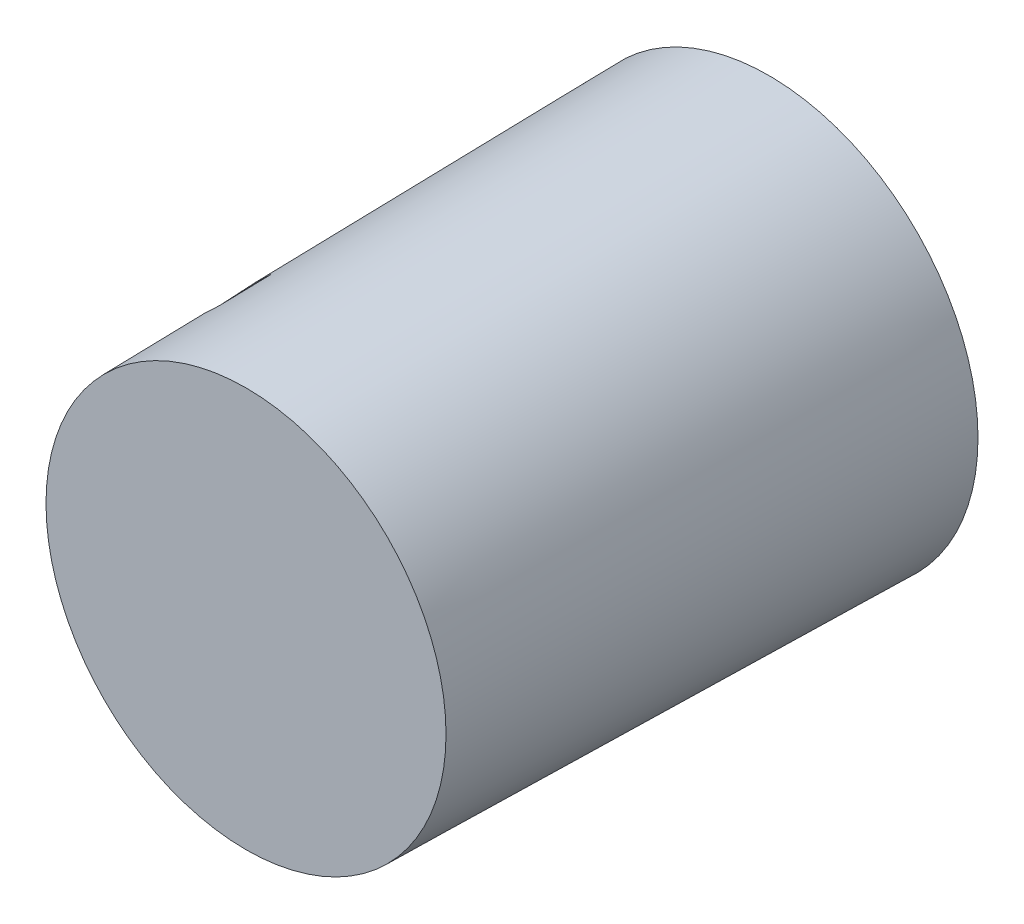
ISO-10303-21;
HEADER;
FILE_DESCRIPTION(('STEP AP214'),'2;1');
FILE_NAME('part.step','',(''),(''),'','','');
FILE_SCHEMA(('AUTOMOTIVE_DESIGN { 1 0 10303 214 1 1 1 1 }'));
ENDSEC;
DATA;
#1=APPLICATION_CONTEXT('core data for automotive mechanical design processes');
#2=APPLICATION_PROTOCOL_DEFINITION('international standard','automotive_design',2000,#1);
#3=PRODUCT_CONTEXT('',#1,'mechanical');
#4=PRODUCT('Part','Part','',(#3));
#5=PRODUCT_RELATED_PRODUCT_CATEGORY('part','',(#4));
#6=PRODUCT_DEFINITION_FORMATION('','',#4);
#7=PRODUCT_DEFINITION_CONTEXT('part definition',#1,'design');
#8=PRODUCT_DEFINITION('design','',#6,#7);
#9=PRODUCT_DEFINITION_SHAPE('','',#8);
#10=(LENGTH_UNIT() NAMED_UNIT(*) SI_UNIT(.MILLI.,.METRE.));
#11=(NAMED_UNIT(*) PLANE_ANGLE_UNIT() SI_UNIT($,.RADIAN.));
#12=(NAMED_UNIT(*) SI_UNIT($,.STERADIAN.) SOLID_ANGLE_UNIT());
#13=UNCERTAINTY_MEASURE_WITH_UNIT(LENGTH_MEASURE(1.E-05),#10,'distance_accuracy_value','');
#14=(GEOMETRIC_REPRESENTATION_CONTEXT(3) GLOBAL_UNCERTAINTY_ASSIGNED_CONTEXT((#13)) GLOBAL_UNIT_ASSIGNED_CONTEXT((#10,
#11,#12)) REPRESENTATION_CONTEXT('',''));
#15=CARTESIAN_POINT('',(0.,0.,0.));
#16=DIRECTION('',(0.,0.,1.));
#17=DIRECTION('',(1.,0.,0.));
#18=AXIS2_PLACEMENT_3D('',#15,#16,#17);
#19=CARTESIAN_POINT('',(0.,0.,0.));
#20=DIRECTION('',(0.,0.,-1.));
#21=DIRECTION('',(1.,0.,0.));
#22=AXIS2_PLACEMENT_3D('',#19,#20,#21);
#23=CONICAL_SURFACE('',#22,10.,0.0174532925199433);
#24=CARTESIAN_POINT('',(0.,0.,0.));
#25=DIRECTION('',(0.,0.,1.));
#26=DIRECTION('',(1.,0.,0.));
#27=AXIS2_PLACEMENT_3D('',#24,#25,#26);
#28=CIRCLE('',#27,10.);
#29=CARTESIAN_POINT('',(10.,0.,0.));
#30=VERTEX_POINT('',#29);
#31=EDGE_CURVE('E154',#30,#30,#28,.T.);
#32=ORIENTED_EDGE('',*,*,#31,.T.);
#33=EDGE_LOOP('',(#32));
#34=FACE_BOUND('',#33,.T.);
#35=CARTESIAN_POINT('',(0.,0.,25.));
#36=DIRECTION('',(0.,0.,1.));
#37=DIRECTION('',(1.,0.,0.));
#38=AXIS2_PLACEMENT_3D('',#35,#36,#37);
#39=CIRCLE('',#38,9.56362337679456);
#40=CARTESIAN_POINT('',(9.56362337679456,0.,25.));
#41=VERTEX_POINT('',#40);
#42=EDGE_CURVE('E56',#41,#41,#39,.T.);
#43=ORIENTED_EDGE('',*,*,#42,.F.);
#44=EDGE_LOOP('',(#43));
#45=FACE_BOUND('',#44,.T.);
#46=CARTESIAN_POINT('',(-8.35035481952416,4.82107960288119,20.5006853717962));
#47=CARTESIAN_POINT('',(-8.30901590989764,4.89267739384217,20.5006807792256));
#48=CARTESIAN_POINT('',(-8.26681754377874,4.96386055335001,20.4938263438443));
#49=CARTESIAN_POINT('',(-8.18206861712117,5.1032462062416,20.4666106198321));
#50=CARTESIAN_POINT('',(-8.13951838046467,5.17145114141038,20.4462606262934));
#51=CARTESIAN_POINT('',(-8.05539336276017,5.30323951851139,20.3926573244357));
#52=CARTESIAN_POINT('',(-8.01381855207625,5.36682310097552,20.3594044086802));
#53=CARTESIAN_POINT('',(-7.93310456226344,5.48783853942176,20.2809245792719));
#54=CARTESIAN_POINT('',(-7.89396531158249,5.54527057616021,20.2356980175871));
#55=CARTESIAN_POINT('',(-7.81957668164205,5.65270130917386,20.1344978254785));
#56=CARTESIAN_POINT('',(-7.78432724575179,5.70270011367122,20.0785243515487));
#57=CARTESIAN_POINT('',(-7.71910988342622,5.79419815282617,19.9573168354241));
#58=CARTESIAN_POINT('',(-7.68914199900527,5.83569731987021,19.892082719569));
#59=CARTESIAN_POINT('',(-7.63574415619,5.90933185218868,19.7540811313584));
#60=CARTESIAN_POINT('',(-7.61231438493825,5.94146694943341,19.6813134434487));
#61=CARTESIAN_POINT('',(-7.57306601782308,5.9956608908538,19.5303154595712));
#62=CARTESIAN_POINT('',(-7.55723595520645,6.01773491303073,19.4520935986338));
#63=CARTESIAN_POINT('',(-7.53391967664121,6.05134884464351,19.2925450553513));
#64=CARTESIAN_POINT('',(-7.52640078671282,6.06292997249158,19.2112318406473));
#65=CARTESIAN_POINT('',(-7.51996163233247,6.07546350569193,19.0475061914602));
#66=CARTESIAN_POINT('',(-7.52103582037272,6.07642276734077,18.9650945004362));
#67=CARTESIAN_POINT('',(-7.53172911943479,6.06771865547817,18.80139817614));
#68=CARTESIAN_POINT('',(-7.5413480781491,6.05805547130734,18.7201135228051));
#69=CARTESIAN_POINT('',(-7.56869234320365,6.0283191525971,18.5608885523391));
#70=CARTESIAN_POINT('',(-7.58641733884417,6.00824641704584,18.4829481071516));
#71=CARTESIAN_POINT('',(-7.62918767547956,5.95811004714874,18.3324865466646));
#72=CARTESIAN_POINT('',(-7.65423269769143,5.92804684787414,18.2599651955392));
#73=CARTESIAN_POINT('',(-7.71058501770234,5.85853569512679,18.1222276392646));
#74=CARTESIAN_POINT('',(-7.74189211904305,5.81908803606255,18.0570112050406));
#75=CARTESIAN_POINT('',(-7.80951652206611,5.73159514635982,17.9355629839047));
#76=CARTESIAN_POINT('',(-7.84583379001154,5.68354997361366,17.8793311364989));
#77=CARTESIAN_POINT('',(-7.92210092829006,5.5798437354122,17.7773180982634));
#78=CARTESIAN_POINT('',(-7.96205087490529,5.52418251001597,17.7315371269613));
#79=CARTESIAN_POINT('',(-8.04413989501634,5.40644723167056,17.6516598303125));
#80=CARTESIAN_POINT('',(-8.08627905929555,5.34437291267478,17.6175639899759));
#81=CARTESIAN_POINT('',(-8.17129672457637,5.21525899671283,17.5620180888698));
#82=CARTESIAN_POINT('',(-8.21417526007013,5.14821916761899,17.5405686197133));
#83=CARTESIAN_POINT('',(-8.2992194826927,5.01096644419478,17.5109679798273));
#84=CARTESIAN_POINT('',(-8.34138610051666,4.94075821876187,17.5027978587212));
#85=CARTESIAN_POINT('',(-8.42379991016245,4.79899663203015,17.4999422489495));
#86=CARTESIAN_POINT('',(-8.46404795833344,4.72744389111764,17.5052506856434));
#87=CARTESIAN_POINT('',(-8.54159063345102,4.58497215429527,17.5291797113743));
#88=CARTESIAN_POINT('',(-8.5788853223154,4.51405314512678,17.5478000212432));
#89=CARTESIAN_POINT('',(-8.64970287026738,4.3748917322732,17.5978037340307));
#90=CARTESIAN_POINT('',(-8.68322588674644,4.30664921697581,17.629186604117));
#91=CARTESIAN_POINT('',(-8.74592426127498,4.17483017754559,17.7038252557831));
#92=CARTESIAN_POINT('',(-8.77509982072397,4.1112534373362,17.7470804871021));
#93=CARTESIAN_POINT('',(-8.82874378727705,3.99063853363356,17.8442908487094));
#94=CARTESIAN_POINT('',(-8.85321235255673,3.93360015044897,17.8982456193224));
#95=CARTESIAN_POINT('',(-8.89725219801214,3.82777534408074,18.0154448218291));
#96=CARTESIAN_POINT('',(-8.91682352156372,3.77898884780976,18.0786891714352));
#97=CARTESIAN_POINT('',(-8.95099499908356,3.6911854889963,18.2128433653388));
#98=CARTESIAN_POINT('',(-8.96559506065196,3.65216880804706,18.2837533520837));
#99=CARTESIAN_POINT('',(-8.98981852173397,3.58517946507663,18.4314089926747));
#100=CARTESIAN_POINT('',(-8.99944172958124,3.55720722840391,18.5081548711396));
#101=CARTESIAN_POINT('',(-9.0137379414371,3.51327179281554,18.6654594139621));
#102=CARTESIAN_POINT('',(-9.01841073160891,3.49730911266979,18.7460182428658));
#103=CARTESIAN_POINT('',(-9.02284081711019,3.47797370497796,18.9087712380937));
#104=CARTESIAN_POINT('',(-9.02259796185011,3.47460136313746,18.9909654544405));
#105=CARTESIAN_POINT('',(-9.01722834641052,3.48058237318209,19.1547290522978));
#106=CARTESIAN_POINT('',(-9.01210155618995,3.48993580334353,19.2362984299619));
#107=CARTESIAN_POINT('',(-8.99698898509948,3.52104286559563,19.3965704446047));
#108=CARTESIAN_POINT('',(-8.98700329886272,3.54279625618282,19.4752731373837));
#109=CARTESIAN_POINT('',(-8.96220534507775,3.59793209259971,19.6276672197059));
#110=CARTESIAN_POINT('',(-8.94739324739593,3.63131412916004,19.7013587855063));
#111=CARTESIAN_POINT('',(-8.91297617298438,3.70860933178274,19.8418101509982));
#112=CARTESIAN_POINT('',(-8.89337136428632,3.75252212863736,19.908570193591));
#113=CARTESIAN_POINT('',(-8.86048192188224,3.82514031965283,20.0021155107532));
#114=CARTESIAN_POINT('',(-8.8489360522709,3.85047629503235,20.032202897221));
#115=CARTESIAN_POINT('',(-8.82468729873255,3.90323590505314,20.0900423541447));
#116=CARTESIAN_POINT('',(-8.81198336251433,3.9306614346024,20.1177922556733));
#117=CARTESIAN_POINT('',(-8.7718322055321,4.01648484805773,20.1979105577177));
#118=CARTESIAN_POINT('',(-8.74262355128985,4.07780793975088,20.246348584454));
#119=CARTESIAN_POINT('',(-8.6799238693427,4.20621471437515,20.33138727036));
#120=CARTESIAN_POINT('',(-8.64643238555441,4.27329901057324,20.3679866673533));
#121=CARTESIAN_POINT('',(-8.59167105834884,4.38008916719784,20.4147415066838));
#122=CARTESIAN_POINT('',(-8.5716784707173,4.41854001785701,20.4293871725085));
#123=CARTESIAN_POINT('',(-8.5307042502664,4.49619082517628,20.4546665456494));
#124=CARTESIAN_POINT('',(-8.50972348865176,4.53539010451477,20.4653037151621));
#125=CARTESIAN_POINT('',(-8.46612115976671,4.61564821512197,20.4827948147187));
#126=CARTESIAN_POINT('',(-8.44346767160932,4.65672284660976,20.4894971706996));
#127=CARTESIAN_POINT('',(-8.39742175335201,4.73893684401087,20.4984440577502));
#128=CARTESIAN_POINT('',(-8.37402922637736,4.78007621773352,20.5006880019185));
#129=CARTESIAN_POINT('',(-8.35035481952416,4.82107960288119,20.5006853717962));
#130=B_SPLINE_CURVE_WITH_KNOTS('',3,(#46,#47,#48,#49,#50,#51,#52,#53,#54,#55,#56,#57,#58,#59,
#60,#61,#62,#63,#64,#65,#66,#67,#68,#69,#70,#71,#72,#73,#74,#75,#76,#77,#78,#79,#80,#81,#82,#83,
#84,#85,#86,#87,#88,#89,#90,#91,#92,#93,#94,#95,#96,#97,#98,#99,#100,#101,#102,#103,#104,#105,
#106,#107,#108,#109,#110,#111,#112,#113,#114,#115,#116,#117,#118,#119,#120,#121,#122,#123,#124,
#125,#126,#127,#128,#129),.UNSPECIFIED.,.T.,.F.,(4,2,2,2,2,2,2,2,2,2,2,2,2,2,2,2,2,2,2,2,2,2,2,
2,2,2,2,2,2,2,2,2,2,2,2,2,2,2,2,2,2,4),(0.,0.247860534053323,0.495513882878181,
0.743159697595364,0.990798233517998,1.23843316366089,1.48607006363205,1.73371405106887,
1.98098319946223,2.22727675468516,2.47341132088167,2.719541499905,2.96566224569119,
3.21177227465495,3.45787458369301,3.70397523563532,3.95008105660807,4.19619709136085,
4.44232463881707,4.6881006390506,4.9337658903564,5.17942598987615,5.42507583422398,
5.67071429510128,5.91634450000938,6.16197252924522,6.40760512367257,6.65324717708735,
6.89889984075144,7.14456002993413,7.39022173018087,7.63587864604737,7.88152691690948,
8.12716657661836,8.25002988132279,8.37300596178211,8.62206908161914,8.87115874659218,
9.00822803486777,9.14517866157361,9.28710738876581,9.42905479809628),.UNSPECIFIED.);
#131=CARTESIAN_POINT('',(-8.35035481952416,4.82107960288119,20.5006853717962));
#132=VERTEX_POINT('',#131);
#133=CARTESIAN_POINT('',(-8.35054697083436,4.82074678876751,20.5006853225746));
#134=VERTEX_POINT('',#133);
#135=EDGE_CURVE('E12',#132,#134,#130,.T.);
#136=ORIENTED_EDGE('',*,*,#135,.F.);
#137=CARTESIAN_POINT('',(-8.37302616052197,4.83416890770911,19.0009138290617));
#138=DIRECTION('',(-0.865893503920756,0.499923847578193,0.0174524064372831));
#139=DIRECTION('',(-0.499999999999997,-0.86602540378444,0.));
#140=AXIS2_PLACEMENT_3D('',#137,#138,#139);
#141=CIRCLE('',#140,1.5);
#142=EDGE_CURVE('E106',#134,#132,#141,.T.);
#143=ORIENTED_EDGE('',*,*,#142,.F.);
#144=EDGE_LOOP('',(#136,#143));
#145=FACE_BOUND('',#144,.T.);
#146=ADVANCED_FACE('F44',(#34,#45,#145),#23,.T.);
#147=CARTESIAN_POINT('',(0.,0.,25.));
#148=DIRECTION('',(0.,0.,1.));
#149=DIRECTION('',(1.,0.,0.));
#150=AXIS2_PLACEMENT_3D('',#147,#148,#149);
#151=PLANE('',#150);
#152=ORIENTED_EDGE('',*,*,#42,.T.);
#153=EDGE_LOOP('',(#152));
#154=FACE_BOUND('',#153,.T.);
#155=ADVANCED_FACE('F139',(#154),#151,.T.);
#156=CARTESIAN_POINT('',(0.,0.,0.));
#157=DIRECTION('',(0.,0.,1.));
#158=DIRECTION('',(1.,0.,0.));
#159=AXIS2_PLACEMENT_3D('',#156,#157,#158);
#160=PLANE('',#159);
#161=DIRECTION('',(0.,-1.,0.));
#162=VECTOR('',#161,1.);
#163=CARTESIAN_POINT('',(-2.5,0.,0.));
#164=LINE('',#163,#162);
#165=CARTESIAN_POINT('',(-2.5,2.5,0.));
#166=VERTEX_POINT('',#165);
#167=CARTESIAN_POINT('',(-2.5,-2.5,0.));
#168=VERTEX_POINT('',#167);
#169=EDGE_CURVE('E63',#166,#168,#164,.T.);
#170=ORIENTED_EDGE('',*,*,#169,.T.);
#171=CARTESIAN_POINT('',(0.,-2.5,0.));
#172=DIRECTION('',(0.,0.,1.));
#173=DIRECTION('',(1.,0.,0.));
#174=AXIS2_PLACEMENT_3D('',#171,#172,#173);
#175=CIRCLE('',#174,2.5);
#176=CARTESIAN_POINT('',(2.5,-2.5,0.));
#177=VERTEX_POINT('',#176);
#178=EDGE_CURVE('E172',#168,#177,#175,.T.);
#179=ORIENTED_EDGE('',*,*,#178,.T.);
#180=DIRECTION('',(0.,-1.,0.));
#181=VECTOR('',#180,1.);
#182=CARTESIAN_POINT('',(2.5,0.,0.));
#183=LINE('',#182,#181);
#184=CARTESIAN_POINT('',(2.5,2.5,0.));
#185=VERTEX_POINT('',#184);
#186=EDGE_CURVE('E170',#185,#177,#183,.T.);
#187=ORIENTED_EDGE('',*,*,#186,.F.);
#188=CARTESIAN_POINT('',(0.,2.5,0.));
#189=DIRECTION('',(0.,0.,1.));
#190=DIRECTION('',(1.,0.,0.));
#191=AXIS2_PLACEMENT_3D('',#188,#189,#190);
#192=CIRCLE('',#191,2.5);
#193=EDGE_CURVE('E166',#185,#166,#192,.T.);
#194=ORIENTED_EDGE('',*,*,#193,.T.);
#195=EDGE_LOOP('',(#170,#179,#187,#194));
#196=FACE_BOUND('',#195,.T.);
#197=ORIENTED_EDGE('',*,*,#31,.F.);
#198=EDGE_LOOP('',(#197));
#199=FACE_BOUND('',#198,.T.);
#200=ADVANCED_FACE('F138',(#196,#199),#160,.F.);
#201=CARTESIAN_POINT('',(-2.5,0.,2.));
#202=DIRECTION('',(1.,0.,0.));
#203=DIRECTION('',(0.,0.,-1.));
#204=AXIS2_PLACEMENT_3D('',#201,#202,#203);
#205=PLANE('',#204);
#206=ORIENTED_EDGE('',*,*,#169,.F.);
#207=DIRECTION('',(0.,0.,-1.));
#208=VECTOR('',#207,1.);
#209=CARTESIAN_POINT('',(-2.5,2.5,2.));
#210=LINE('',#209,#208);
#211=CARTESIAN_POINT('',(-2.5,2.5,2.));
#212=VERTEX_POINT('',#211);
#213=EDGE_CURVE('E164',#212,#166,#210,.T.);
#214=ORIENTED_EDGE('',*,*,#213,.F.);
#215=DIRECTION('',(0.,-1.,0.));
#216=VECTOR('',#215,1.);
#217=CARTESIAN_POINT('',(-2.5,0.,2.));
#218=LINE('',#217,#216);
#219=CARTESIAN_POINT('',(-2.5,-2.5,2.));
#220=VERTEX_POINT('',#219);
#221=EDGE_CURVE('E169',#212,#220,#218,.T.);
#222=ORIENTED_EDGE('',*,*,#221,.T.);
#223=DIRECTION('',(0.,0.,-1.));
#224=VECTOR('',#223,1.);
#225=CARTESIAN_POINT('',(-2.5,-2.5,2.));
#226=LINE('',#225,#224);
#227=EDGE_CURVE('E157',#220,#168,#226,.T.);
#228=ORIENTED_EDGE('',*,*,#227,.T.);
#229=EDGE_LOOP('',(#206,#214,#222,#228));
#230=FACE_BOUND('',#229,.T.);
#231=ADVANCED_FACE('F134',(#230),#205,.T.);
#232=CARTESIAN_POINT('',(0.,-2.5,2.));
#233=DIRECTION('',(0.,0.,-1.));
#234=DIRECTION('',(-1.,0.,0.));
#235=AXIS2_PLACEMENT_3D('',#232,#233,#234);
#236=CYLINDRICAL_SURFACE('',#235,2.5);
#237=ORIENTED_EDGE('',*,*,#178,.F.);
#238=ORIENTED_EDGE('',*,*,#227,.F.);
#239=CARTESIAN_POINT('',(0.,-2.5,2.));
#240=DIRECTION('',(0.,0.,1.));
#241=DIRECTION('',(1.,0.,0.));
#242=AXIS2_PLACEMENT_3D('',#239,#240,#241);
#243=CIRCLE('',#242,2.5);
#244=CARTESIAN_POINT('',(2.5,-2.5,2.));
#245=VERTEX_POINT('',#244);
#246=EDGE_CURVE('E96',#220,#245,#243,.T.);
#247=ORIENTED_EDGE('',*,*,#246,.T.);
#248=DIRECTION('',(0.,0.,-1.));
#249=VECTOR('',#248,1.);
#250=CARTESIAN_POINT('',(2.5,-2.5,2.));
#251=LINE('',#250,#249);
#252=EDGE_CURVE('E161',#245,#177,#251,.T.);
#253=ORIENTED_EDGE('',*,*,#252,.T.);
#254=EDGE_LOOP('',(#237,#238,#247,#253));
#255=FACE_BOUND('',#254,.T.);
#256=ADVANCED_FACE('F131',(#255),#236,.F.);
#257=CARTESIAN_POINT('',(2.5,0.,2.));
#258=DIRECTION('',(1.,0.,0.));
#259=DIRECTION('',(0.,0.,-1.));
#260=AXIS2_PLACEMENT_3D('',#257,#258,#259);
#261=PLANE('',#260);
#262=ORIENTED_EDGE('',*,*,#186,.T.);
#263=ORIENTED_EDGE('',*,*,#252,.F.);
#264=DIRECTION('',(0.,-1.,0.));
#265=VECTOR('',#264,1.);
#266=CARTESIAN_POINT('',(2.5,0.,2.));
#267=LINE('',#266,#265);
#268=CARTESIAN_POINT('',(2.5,2.5,2.));
#269=VERTEX_POINT('',#268);
#270=EDGE_CURVE('E177',#269,#245,#267,.T.);
#271=ORIENTED_EDGE('',*,*,#270,.F.);
#272=DIRECTION('',(0.,0.,-1.));
#273=VECTOR('',#272,1.);
#274=CARTESIAN_POINT('',(2.5,2.5,2.));
#275=LINE('',#274,#273);
#276=EDGE_CURVE('E88',#269,#185,#275,.T.);
#277=ORIENTED_EDGE('',*,*,#276,.T.);
#278=EDGE_LOOP('',(#262,#263,#271,#277));
#279=FACE_BOUND('',#278,.T.);
#280=ADVANCED_FACE('F128',(#279),#261,.F.);
#281=CARTESIAN_POINT('',(0.,2.5,2.));
#282=DIRECTION('',(0.,0.,-1.));
#283=DIRECTION('',(-1.,0.,0.));
#284=AXIS2_PLACEMENT_3D('',#281,#282,#283);
#285=CYLINDRICAL_SURFACE('',#284,2.5);
#286=ORIENTED_EDGE('',*,*,#193,.F.);
#287=ORIENTED_EDGE('',*,*,#276,.F.);
#288=CARTESIAN_POINT('',(0.,2.5,2.));
#289=DIRECTION('',(0.,0.,1.));
#290=DIRECTION('',(1.,0.,0.));
#291=AXIS2_PLACEMENT_3D('',#288,#289,#290);
#292=CIRCLE('',#291,2.5);
#293=EDGE_CURVE('E71',#269,#212,#292,.T.);
#294=ORIENTED_EDGE('',*,*,#293,.T.);
#295=ORIENTED_EDGE('',*,*,#213,.T.);
#296=EDGE_LOOP('',(#286,#287,#294,#295));
#297=FACE_BOUND('',#296,.T.);
#298=ADVANCED_FACE('F125',(#297),#285,.F.);
#299=CARTESIAN_POINT('',(0.,0.,2.));
#300=DIRECTION('',(0.,0.,1.));
#301=DIRECTION('',(1.,0.,0.));
#302=AXIS2_PLACEMENT_3D('',#299,#300,#301);
#303=PLANE('',#302);
#304=ORIENTED_EDGE('',*,*,#221,.F.);
#305=ORIENTED_EDGE('',*,*,#293,.F.);
#306=ORIENTED_EDGE('',*,*,#270,.T.);
#307=ORIENTED_EDGE('',*,*,#246,.F.);
#308=EDGE_LOOP('',(#304,#305,#306,#307));
#309=FACE_BOUND('',#308,.T.);
#310=ADVANCED_FACE('F118',(#309),#303,.F.);
#311=DIRECTION('',(0.86602540378444,-0.499999999999998,0.));
#312=VECTOR('',#311,1.);
#313=SURFACE_OF_LINEAR_EXTRUSION('',#141,#312);
#314=CARTESIAN_POINT('',(-4.04289914159977,2.33416890770912,19.0009138290617));
#315=DIRECTION('',(-0.865893503920756,0.499923847578193,0.0174524064372831));
#316=DIRECTION('',(-0.499999999999997,-0.86602540378444,0.));
#317=AXIS2_PLACEMENT_3D('',#314,#315,#316);
#318=CIRCLE('',#317,1.5);
#319=CARTESIAN_POINT('',(-4.79289914159977,1.03513080203246,19.0009138290617));
#320=VERTEX_POINT('',#319);
#321=EDGE_CURVE('E108',#320,#320,#318,.T.);
#322=ORIENTED_EDGE('',*,*,#321,.F.);
#323=EDGE_LOOP('',(#322));
#324=FACE_BOUND('',#323,.T.);
#325=ORIENTED_EDGE('',*,*,#142,.T.);
#326=ORIENTED_EDGE('',*,*,#135,.T.);
#327=EDGE_LOOP('',(#325,#326));
#328=FACE_BOUND('',#327,.T.);
#329=ADVANCED_FACE('F105',(#324,#328),#313,.T.);
#330=CARTESIAN_POINT('',(-4.32748922002254,2.49847707138828,0.174497483369393));
#331=DIRECTION('',(-0.865893503691733,0.499923847975355,0.0174524064234256));
#332=DIRECTION('',(-0.500000000397099,-0.866025403555173,0.));
#333=AXIS2_PLACEMENT_3D('',#330,#331,#332);
#334=PLANE('',#333);
#335=ORIENTED_EDGE('',*,*,#321,.T.);
#336=EDGE_LOOP('',(#335));
#337=FACE_BOUND('',#336,.T.);
#338=ADVANCED_FACE('F117',(#337),#334,.T.);
#339=CLOSED_SHELL('',(#146,#155,#200,#231,#256,#280,#298,#310,#329,#338));
#340=MANIFOLD_SOLID_BREP('B2',#339);
#341=ADVANCED_BREP_SHAPE_REPRESENTATION('',(#18,#340),#14);
#342=SHAPE_DEFINITION_REPRESENTATION(#9,#341);
ENDSEC;
END-ISO-10303-21;
